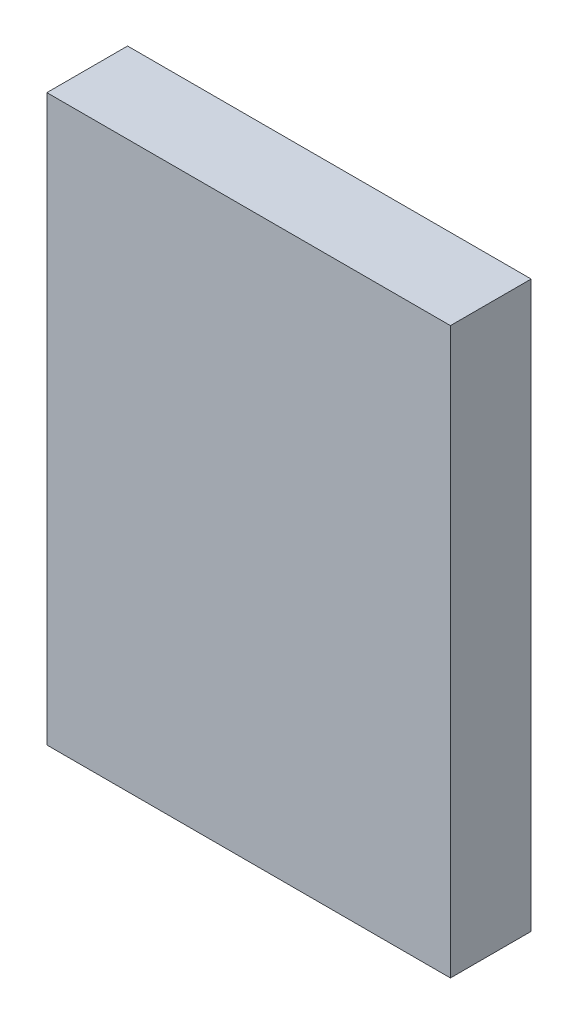
ISO-10303-21;
HEADER;
FILE_DESCRIPTION(('STEP AP214'),'2;1');
FILE_NAME('part.step','',(''),(''),'','','');
FILE_SCHEMA(('AUTOMOTIVE_DESIGN { 1 0 10303 214 1 1 1 1 }'));
ENDSEC;
DATA;
#1=APPLICATION_CONTEXT('core data for automotive mechanical design processes');
#2=APPLICATION_PROTOCOL_DEFINITION('international standard','automotive_design',2000,#1);
#3=PRODUCT_CONTEXT('',#1,'mechanical');
#4=PRODUCT('Part','Part','',(#3));
#5=PRODUCT_RELATED_PRODUCT_CATEGORY('part','',(#4));
#6=PRODUCT_DEFINITION_FORMATION('','',#4);
#7=PRODUCT_DEFINITION_CONTEXT('part definition',#1,'design');
#8=PRODUCT_DEFINITION('design','',#6,#7);
#9=PRODUCT_DEFINITION_SHAPE('','',#8);
#10=(LENGTH_UNIT() NAMED_UNIT(*) SI_UNIT(.MILLI.,.METRE.));
#11=(NAMED_UNIT(*) PLANE_ANGLE_UNIT() SI_UNIT($,.RADIAN.));
#12=(NAMED_UNIT(*) SI_UNIT($,.STERADIAN.) SOLID_ANGLE_UNIT());
#13=UNCERTAINTY_MEASURE_WITH_UNIT(LENGTH_MEASURE(1.E-05),#10,'distance_accuracy_value','');
#14=(GEOMETRIC_REPRESENTATION_CONTEXT(3) GLOBAL_UNCERTAINTY_ASSIGNED_CONTEXT((#13)) GLOBAL_UNIT_ASSIGNED_CONTEXT((#10,
#11,#12)) REPRESENTATION_CONTEXT('',''));
#15=CARTESIAN_POINT('',(0.,0.,0.));
#16=DIRECTION('',(0.,0.,1.));
#17=DIRECTION('',(1.,0.,0.));
#18=AXIS2_PLACEMENT_3D('',#15,#16,#17);
#19=CARTESIAN_POINT('',(12.5,-17.5,5.));
#20=DIRECTION('',(-1.,0.,0.));
#21=DIRECTION('',(0.,0.,1.));
#22=AXIS2_PLACEMENT_3D('',#19,#20,#21);
#23=PLANE('',#22);
#24=DIRECTION('',(0.,1.,0.));
#25=VECTOR('',#24,1.);
#26=CARTESIAN_POINT('',(12.5,-17.5,0.));
#27=LINE('',#26,#25);
#28=CARTESIAN_POINT('',(12.5,-17.5,0.));
#29=VERTEX_POINT('',#28);
#30=CARTESIAN_POINT('',(12.5,17.5,0.));
#31=VERTEX_POINT('',#30);
#32=EDGE_CURVE('E100',#29,#31,#27,.T.);
#33=ORIENTED_EDGE('',*,*,#32,.T.);
#34=DIRECTION('',(0.,0.,-1.));
#35=VECTOR('',#34,1.);
#36=CARTESIAN_POINT('',(12.5,17.5,5.));
#37=LINE('',#36,#35);
#38=CARTESIAN_POINT('',(12.5,17.5,5.));
#39=VERTEX_POINT('',#38);
#40=EDGE_CURVE('E11',#39,#31,#37,.T.);
#41=ORIENTED_EDGE('',*,*,#40,.F.);
#42=DIRECTION('',(0.,1.,0.));
#43=VECTOR('',#42,1.);
#44=CARTESIAN_POINT('',(12.5,-17.5,5.));
#45=LINE('',#44,#43);
#46=CARTESIAN_POINT('',(12.5,-17.5,5.));
#47=VERTEX_POINT('',#46);
#48=EDGE_CURVE('E88',#47,#39,#45,.T.);
#49=ORIENTED_EDGE('',*,*,#48,.F.);
#50=DIRECTION('',(0.,0.,-1.));
#51=VECTOR('',#50,1.);
#52=CARTESIAN_POINT('',(12.5,-17.5,5.));
#53=LINE('',#52,#51);
#54=EDGE_CURVE('E96',#47,#29,#53,.T.);
#55=ORIENTED_EDGE('',*,*,#54,.T.);
#56=EDGE_LOOP('',(#33,#41,#49,#55));
#57=FACE_BOUND('',#56,.T.);
#58=ADVANCED_FACE('F37',(#57),#23,.F.);
#59=CARTESIAN_POINT('',(-12.5,17.5,5.));
#60=DIRECTION('',(0.,-1.,0.));
#61=DIRECTION('',(0.,0.,-1.));
#62=AXIS2_PLACEMENT_3D('',#59,#60,#61);
#63=PLANE('',#62);
#64=DIRECTION('',(-1.,0.,0.));
#65=VECTOR('',#64,1.);
#66=CARTESIAN_POINT('',(-12.5,17.5,0.));
#67=LINE('',#66,#65);
#68=CARTESIAN_POINT('',(-12.5,17.5,0.));
#69=VERTEX_POINT('',#68);
#70=EDGE_CURVE('E92',#31,#69,#67,.T.);
#71=ORIENTED_EDGE('',*,*,#70,.T.);
#72=DIRECTION('',(0.,0.,-1.));
#73=VECTOR('',#72,1.);
#74=CARTESIAN_POINT('',(-12.5,17.5,5.));
#75=LINE('',#74,#73);
#76=CARTESIAN_POINT('',(-12.5,17.5,5.));
#77=VERTEX_POINT('',#76);
#78=EDGE_CURVE('E45',#77,#69,#75,.T.);
#79=ORIENTED_EDGE('',*,*,#78,.F.);
#80=DIRECTION('',(-1.,0.,0.));
#81=VECTOR('',#80,1.);
#82=CARTESIAN_POINT('',(-12.5,17.5,5.));
#83=LINE('',#82,#81);
#84=EDGE_CURVE('E83',#39,#77,#83,.T.);
#85=ORIENTED_EDGE('',*,*,#84,.F.);
#86=ORIENTED_EDGE('',*,*,#40,.T.);
#87=EDGE_LOOP('',(#71,#79,#85,#86));
#88=FACE_BOUND('',#87,.T.);
#89=ADVANCED_FACE('F91',(#88),#63,.F.);
#90=CARTESIAN_POINT('',(-12.5,-17.5,5.));
#91=DIRECTION('',(1.,0.,0.));
#92=DIRECTION('',(0.,0.,-1.));
#93=AXIS2_PLACEMENT_3D('',#90,#91,#92);
#94=PLANE('',#93);
#95=DIRECTION('',(0.,-1.,0.));
#96=VECTOR('',#95,1.);
#97=CARTESIAN_POINT('',(-12.5,-17.5,0.));
#98=LINE('',#97,#96);
#99=CARTESIAN_POINT('',(-12.5,-17.5,0.));
#100=VERTEX_POINT('',#99);
#101=EDGE_CURVE('E70',#69,#100,#98,.T.);
#102=ORIENTED_EDGE('',*,*,#101,.T.);
#103=DIRECTION('',(0.,0.,-1.));
#104=VECTOR('',#103,1.);
#105=CARTESIAN_POINT('',(-12.5,-17.5,5.));
#106=LINE('',#105,#104);
#107=CARTESIAN_POINT('',(-12.5,-17.5,5.));
#108=VERTEX_POINT('',#107);
#109=EDGE_CURVE('E93',#108,#100,#106,.T.);
#110=ORIENTED_EDGE('',*,*,#109,.F.);
#111=DIRECTION('',(0.,-1.,0.));
#112=VECTOR('',#111,1.);
#113=CARTESIAN_POINT('',(-12.5,-17.5,5.));
#114=LINE('',#113,#112);
#115=EDGE_CURVE('E86',#77,#108,#114,.T.);
#116=ORIENTED_EDGE('',*,*,#115,.F.);
#117=ORIENTED_EDGE('',*,*,#78,.T.);
#118=EDGE_LOOP('',(#102,#110,#116,#117));
#119=FACE_BOUND('',#118,.T.);
#120=ADVANCED_FACE('F94',(#119),#94,.F.);
#121=CARTESIAN_POINT('',(-12.5,-17.5,5.));
#122=DIRECTION('',(0.,1.,0.));
#123=DIRECTION('',(0.,0.,1.));
#124=AXIS2_PLACEMENT_3D('',#121,#122,#123);
#125=PLANE('',#124);
#126=DIRECTION('',(1.,0.,0.));
#127=VECTOR('',#126,1.);
#128=CARTESIAN_POINT('',(-12.5,-17.5,0.));
#129=LINE('',#128,#127);
#130=EDGE_CURVE('E76',#100,#29,#129,.T.);
#131=ORIENTED_EDGE('',*,*,#130,.T.);
#132=ORIENTED_EDGE('',*,*,#54,.F.);
#133=DIRECTION('',(1.,0.,0.));
#134=VECTOR('',#133,1.);
#135=CARTESIAN_POINT('',(-12.5,-17.5,5.));
#136=LINE('',#135,#134);
#137=EDGE_CURVE('E53',#108,#47,#136,.T.);
#138=ORIENTED_EDGE('',*,*,#137,.F.);
#139=ORIENTED_EDGE('',*,*,#109,.T.);
#140=EDGE_LOOP('',(#131,#132,#138,#139));
#141=FACE_BOUND('',#140,.T.);
#142=ADVANCED_FACE('F107',(#141),#125,.F.);
#143=CARTESIAN_POINT('',(0.,0.,5.));
#144=DIRECTION('',(0.,0.,-1.));
#145=DIRECTION('',(-1.,0.,0.));
#146=AXIS2_PLACEMENT_3D('',#143,#144,#145);
#147=PLANE('',#146);
#148=ORIENTED_EDGE('',*,*,#48,.T.);
#149=ORIENTED_EDGE('',*,*,#84,.T.);
#150=ORIENTED_EDGE('',*,*,#115,.T.);
#151=ORIENTED_EDGE('',*,*,#137,.T.);
#152=EDGE_LOOP('',(#148,#149,#150,#151));
#153=FACE_BOUND('',#152,.T.);
#154=ADVANCED_FACE('F84',(#153),#147,.F.);
#155=CARTESIAN_POINT('',(0.,0.,0.));
#156=DIRECTION('',(0.,0.,-1.));
#157=DIRECTION('',(-1.,0.,0.));
#158=AXIS2_PLACEMENT_3D('',#155,#156,#157);
#159=PLANE('',#158);
#160=ORIENTED_EDGE('',*,*,#32,.F.);
#161=ORIENTED_EDGE('',*,*,#130,.F.);
#162=ORIENTED_EDGE('',*,*,#101,.F.);
#163=ORIENTED_EDGE('',*,*,#70,.F.);
#164=EDGE_LOOP('',(#160,#161,#162,#163));
#165=FACE_BOUND('',#164,.T.);
#166=ADVANCED_FACE('F110',(#165),#159,.T.);
#167=CLOSED_SHELL('',(#58,#89,#120,#142,#154,#166));
#168=MANIFOLD_SOLID_BREP('B2',#167);
#169=ADVANCED_BREP_SHAPE_REPRESENTATION('',(#18,#168),#14);
#170=SHAPE_DEFINITION_REPRESENTATION(#9,#169);
ENDSEC;
END-ISO-10303-21;
